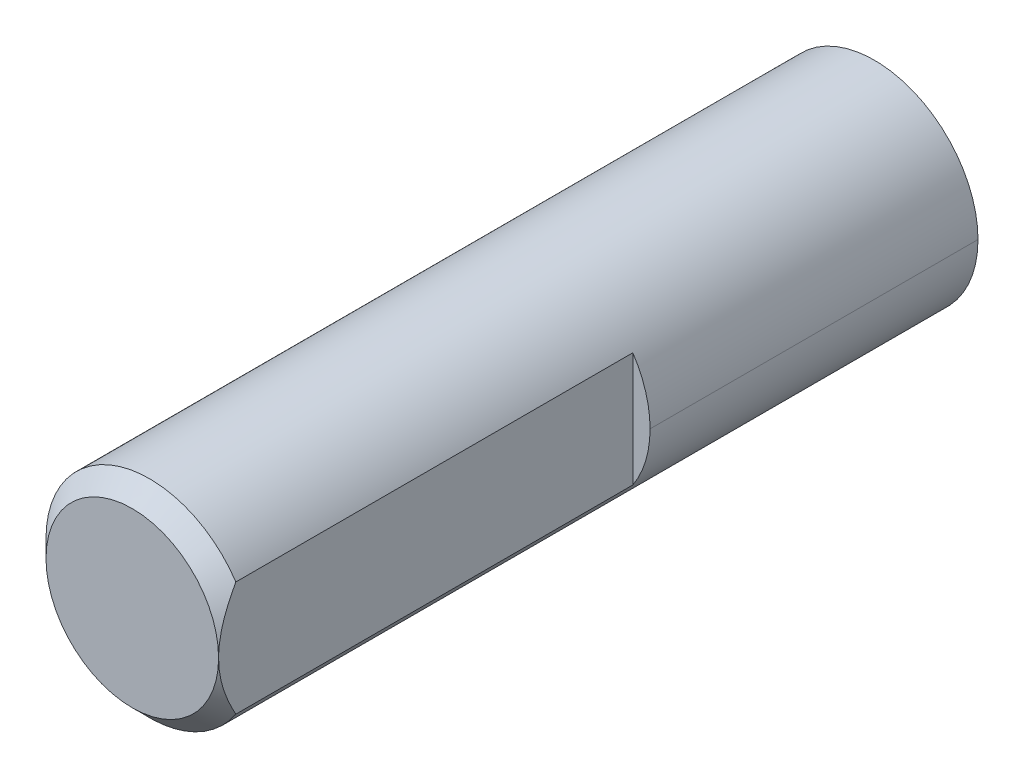
ISO-10303-21;
HEADER;
FILE_DESCRIPTION(('STEP AP214'),'2;1');
FILE_NAME('part.step','',(''),(''),'','','');
FILE_SCHEMA(('AUTOMOTIVE_DESIGN { 1 0 10303 214 1 1 1 1 }'));
ENDSEC;
DATA;
#1=APPLICATION_CONTEXT('core data for automotive mechanical design processes');
#2=APPLICATION_PROTOCOL_DEFINITION('international standard','automotive_design',2000,#1);
#3=PRODUCT_CONTEXT('',#1,'mechanical');
#4=PRODUCT('Part','Part','',(#3));
#5=PRODUCT_RELATED_PRODUCT_CATEGORY('part','',(#4));
#6=PRODUCT_DEFINITION_FORMATION('','',#4);
#7=PRODUCT_DEFINITION_CONTEXT('part definition',#1,'design');
#8=PRODUCT_DEFINITION('design','',#6,#7);
#9=PRODUCT_DEFINITION_SHAPE('','',#8);
#10=(LENGTH_UNIT() NAMED_UNIT(*) SI_UNIT(.MILLI.,.METRE.));
#11=(NAMED_UNIT(*) PLANE_ANGLE_UNIT() SI_UNIT($,.RADIAN.));
#12=(NAMED_UNIT(*) SI_UNIT($,.STERADIAN.) SOLID_ANGLE_UNIT());
#13=UNCERTAINTY_MEASURE_WITH_UNIT(LENGTH_MEASURE(1.E-05),#10,'distance_accuracy_value','');
#14=(GEOMETRIC_REPRESENTATION_CONTEXT(3) GLOBAL_UNCERTAINTY_ASSIGNED_CONTEXT((#13)) GLOBAL_UNIT_ASSIGNED_CONTEXT((#10,
#11,#12)) REPRESENTATION_CONTEXT('',''));
#15=CARTESIAN_POINT('',(0.,0.,0.));
#16=DIRECTION('',(0.,0.,1.));
#17=DIRECTION('',(1.,0.,0.));
#18=AXIS2_PLACEMENT_3D('',#15,#16,#17);
#19=CARTESIAN_POINT('',(0.,0.,21.5));
#20=DIRECTION('',(0.,0.,-1.));
#21=DIRECTION('',(-1.,0.,0.));
#22=AXIS2_PLACEMENT_3D('',#19,#20,#21);
#23=CONICAL_SURFACE('',#22,2.5,0.78539816339745);
#24=DIRECTION('',(-0.707106781186549,0.,-0.707106781186547));
#25=VECTOR('',#24,1.);
#26=CARTESIAN_POINT('',(-2.5,0.,21.5));
#27=LINE('',#26,#25);
#28=CARTESIAN_POINT('',(-2.5,0.,21.5));
#29=VERTEX_POINT('',#28);
#30=CARTESIAN_POINT('',(-3.,0.,21.));
#31=VERTEX_POINT('',#30);
#32=EDGE_CURVE('E90',#29,#31,#27,.T.);
#33=ORIENTED_EDGE('',*,*,#32,.F.);
#34=CARTESIAN_POINT('',(0.,0.,21.5));
#35=DIRECTION('',(0.,0.,1.));
#36=DIRECTION('',(1.,0.,0.));
#37=AXIS2_PLACEMENT_3D('',#34,#35,#36);
#38=CIRCLE('',#37,2.5);
#39=CARTESIAN_POINT('',(2.5,0.,21.5));
#40=VERTEX_POINT('',#39);
#41=EDGE_CURVE('E87',#40,#29,#38,.T.);
#42=ORIENTED_EDGE('',*,*,#41,.F.);
#43=CARTESIAN_POINT('',(2.5,1.6583123951777,21.));
#44=CARTESIAN_POINT('',(2.5,1.61304419071273,21.0250200255843));
#45=CARTESIAN_POINT('',(2.5,1.56747781751027,21.049499427219));
#46=CARTESIAN_POINT('',(2.5,1.47571363154993,21.0972096867305));
#47=CARTESIAN_POINT('',(2.5,1.42951600534283,21.1204409038781));
#48=CARTESIAN_POINT('',(2.5,1.28946898250347,21.188233741468));
#49=CARTESIAN_POINT('',(2.5,1.19456817295725,21.2306685534991));
#50=CARTESIAN_POINT('',(2.5,1.00435832661106,21.3071641313579));
#51=CARTESIAN_POINT('',(2.5,0.909128166857114,21.3414185932365));
#52=CARTESIAN_POINT('',(2.5,0.715960996402802,21.4011186383457));
#53=CARTESIAN_POINT('',(2.5,0.618025975916638,21.4265705213043));
#54=CARTESIAN_POINT('',(2.5,0.434096531038004,21.46395141614));
#55=CARTESIAN_POINT('',(2.5,0.348395131920397,21.4772928993308));
#56=CARTESIAN_POINT('',(2.5,0.218706232970866,21.4908266543301));
#57=CARTESIAN_POINT('',(2.5,0.175042274887079,21.4942588205655));
#58=CARTESIAN_POINT('',(2.5,0.087588185021699,21.4988484547413));
#59=CARTESIAN_POINT('',(2.5,0.0437980337548233,21.5000055502065));
#60=CARTESIAN_POINT('',(2.5,0.,21.5));
#61=B_SPLINE_CURVE_WITH_KNOTS('',3,(#43,#44,#45,#46,#47,#48,#49,#50,#51,#52,#53,#54,#55,#56,#57,
#58,#59,#60),.UNSPECIFIED.,.F.,.F.,(4,2,2,2,2,2,2,2,4),(0.,0.155160114661544,0.310275326953932,
0.621889187467568,0.925164565305234,1.22822244720193,1.48798349653102,1.61932602447731,
1.75069005406606),.UNSPECIFIED.);
#62=CARTESIAN_POINT('',(2.5,1.6583123951777,21.));
#63=VERTEX_POINT('',#62);
#64=EDGE_CURVE('E33',#63,#40,#61,.T.);
#65=ORIENTED_EDGE('',*,*,#64,.F.);
#66=CARTESIAN_POINT('',(0.,0.,21.));
#67=DIRECTION('',(0.,0.,-1.));
#68=DIRECTION('',(1.,0.,0.));
#69=AXIS2_PLACEMENT_3D('',#66,#67,#68);
#70=CIRCLE('',#69,3.);
#71=EDGE_CURVE('E288',#31,#63,#70,.T.);
#72=ORIENTED_EDGE('',*,*,#71,.F.);
#73=EDGE_LOOP('',(#33,#42,#65,#72));
#74=FACE_BOUND('',#73,.T.);
#75=ADVANCED_FACE('F17',(#74),#23,.T.);
#76=CARTESIAN_POINT('',(0.,0.,9.5));
#77=DIRECTION('',(0.,0.,1.));
#78=DIRECTION('',(1.,0.,0.));
#79=AXIS2_PLACEMENT_3D('',#76,#77,#78);
#80=PLANE('',#79);
#81=CARTESIAN_POINT('',(0.,0.,9.5));
#82=DIRECTION('',(0.,0.,1.));
#83=DIRECTION('',(1.,0.,0.));
#84=AXIS2_PLACEMENT_3D('',#81,#82,#83);
#85=CIRCLE('',#84,3.);
#86=CARTESIAN_POINT('',(2.5,-1.6583123951777,9.5));
#87=VERTEX_POINT('',#86);
#88=CARTESIAN_POINT('',(3.,0.,9.5));
#89=VERTEX_POINT('',#88);
#90=EDGE_CURVE('E117',#87,#89,#85,.T.);
#91=ORIENTED_EDGE('',*,*,#90,.T.);
#92=CARTESIAN_POINT('',(0.,0.,9.5));
#93=DIRECTION('',(0.,0.,1.));
#94=DIRECTION('',(1.,0.,0.));
#95=AXIS2_PLACEMENT_3D('',#92,#93,#94);
#96=CIRCLE('',#95,3.);
#97=CARTESIAN_POINT('',(2.5,1.6583123951777,9.5));
#98=VERTEX_POINT('',#97);
#99=EDGE_CURVE('E103',#89,#98,#96,.T.);
#100=ORIENTED_EDGE('',*,*,#99,.T.);
#101=DIRECTION('',(0.,-1.,0.));
#102=VECTOR('',#101,1.);
#103=CARTESIAN_POINT('',(2.5,1.6583123951777,9.5));
#104=LINE('',#103,#102);
#105=EDGE_CURVE('E11',#98,#87,#104,.T.);
#106=ORIENTED_EDGE('',*,*,#105,.T.);
#107=EDGE_LOOP('',(#91,#100,#106));
#108=FACE_BOUND('',#107,.T.);
#109=ADVANCED_FACE('F130',(#108),#80,.T.);
#110=CARTESIAN_POINT('',(2.5,1.6583123951777,9.5));
#111=DIRECTION('',(-1.,0.,0.));
#112=DIRECTION('',(0.,0.,1.));
#113=AXIS2_PLACEMENT_3D('',#110,#111,#112);
#114=PLANE('',#113);
#115=ORIENTED_EDGE('',*,*,#64,.T.);
#116=CARTESIAN_POINT('',(2.5,0.,21.5));
#117=CARTESIAN_POINT('',(2.5,-0.0768428391803912,21.5000643176381));
#118=CARTESIAN_POINT('',(2.5,-0.153646619440305,21.4964585669139));
#119=CARTESIAN_POINT('',(2.5,-0.306486913990632,21.4824138186157));
#120=CARTESIAN_POINT('',(2.5,-0.382524604614593,21.4719877566791));
#121=CARTESIAN_POINT('',(2.5,-0.532231201598343,21.4450231886171));
#122=CARTESIAN_POINT('',(2.5,-0.605918543015127,21.4285851348585));
#123=CARTESIAN_POINT('',(2.5,-0.751897163106769,21.3903277696489));
#124=CARTESIAN_POINT('',(2.5,-0.824187885624653,21.3685063602177));
#125=CARTESIAN_POINT('',(2.5,-0.96136120455937,21.3222417065684));
#126=CARTESIAN_POINT('',(2.5,-1.02636662586387,21.2981581621012));
#127=CARTESIAN_POINT('',(2.5,-1.15505562355539,21.2466971992364));
#128=CARTESIAN_POINT('',(2.5,-1.21873914323977,21.2193196398836));
#129=CARTESIAN_POINT('',(2.5,-1.34581351001767,21.1613450460911));
#130=CARTESIAN_POINT('',(2.5,-1.40918435962136,21.1307045192353));
#131=CARTESIAN_POINT('',(2.5,-1.53466113602633,21.067035036112));
#132=CARTESIAN_POINT('',(2.5,-1.59676793059763,21.0340077944289));
#133=CARTESIAN_POINT('',(2.5,-1.6583123951777,21.));
#134=B_SPLINE_CURVE_WITH_KNOTS('',3,(#116,#117,#118,#119,#120,#121,#122,#123,#124,#125,#126,
#127,#128,#129,#130,#131,#132,#133),.UNSPECIFIED.,.F.,.F.,(4,2,2,2,2,2,2,2,4),(0.,
0.230381722715166,0.460327757459298,0.686595219702826,0.912951001700759,1.120819357645,
1.32869661170077,1.53981070703045,1.75077462023261),.UNSPECIFIED.);
#135=CARTESIAN_POINT('',(2.5,-1.6583123951777,21.));
#136=VERTEX_POINT('',#135);
#137=EDGE_CURVE('E21',#40,#136,#134,.T.);
#138=ORIENTED_EDGE('',*,*,#137,.T.);
#139=DIRECTION('',(0.,0.,1.));
#140=VECTOR('',#139,1.);
#141=CARTESIAN_POINT('',(2.5,-1.6583123951777,9.5));
#142=LINE('',#141,#140);
#143=EDGE_CURVE('E113',#87,#136,#142,.T.);
#144=ORIENTED_EDGE('',*,*,#143,.F.);
#145=ORIENTED_EDGE('',*,*,#105,.F.);
#146=DIRECTION('',(0.,0.,1.));
#147=VECTOR('',#146,1.);
#148=CARTESIAN_POINT('',(2.5,1.6583123951777,9.5));
#149=LINE('',#148,#147);
#150=EDGE_CURVE('E83',#98,#63,#149,.T.);
#151=ORIENTED_EDGE('',*,*,#150,.T.);
#152=EDGE_LOOP('',(#115,#138,#144,#145,#151));
#153=FACE_BOUND('',#152,.T.);
#154=ADVANCED_FACE('F79',(#153),#114,.F.);
#155=CARTESIAN_POINT('',(0.,0.,0.));
#156=DIRECTION('',(0.,0.,1.));
#157=DIRECTION('',(1.,0.,0.));
#158=AXIS2_PLACEMENT_3D('',#155,#156,#157);
#159=PLANE('',#158);
#160=CARTESIAN_POINT('',(0.,0.,0.));
#161=DIRECTION('',(0.,0.,1.));
#162=DIRECTION('',(1.,0.,0.));
#163=AXIS2_PLACEMENT_3D('',#160,#161,#162);
#164=CIRCLE('',#163,3.);
#165=CARTESIAN_POINT('',(-3.,0.,0.));
#166=VERTEX_POINT('',#165);
#167=CARTESIAN_POINT('',(3.,0.,0.));
#168=VERTEX_POINT('',#167);
#169=EDGE_CURVE('E95',#166,#168,#164,.T.);
#170=ORIENTED_EDGE('',*,*,#169,.F.);
#171=CARTESIAN_POINT('',(0.,0.,0.));
#172=DIRECTION('',(0.,0.,1.));
#173=DIRECTION('',(1.,0.,0.));
#174=AXIS2_PLACEMENT_3D('',#171,#172,#173);
#175=CIRCLE('',#174,3.);
#176=EDGE_CURVE('E299',#168,#166,#175,.T.);
#177=ORIENTED_EDGE('',*,*,#176,.F.);
#178=EDGE_LOOP('',(#170,#177));
#179=FACE_BOUND('',#178,.T.);
#180=ADVANCED_FACE('F129',(#179),#159,.F.);
#181=CARTESIAN_POINT('',(0.,0.,21.5));
#182=DIRECTION('',(0.,0.,1.));
#183=DIRECTION('',(1.,0.,0.));
#184=AXIS2_PLACEMENT_3D('',#181,#182,#183);
#185=PLANE('',#184);
#186=ORIENTED_EDGE('',*,*,#41,.T.);
#187=CARTESIAN_POINT('',(0.,0.,21.5));
#188=DIRECTION('',(0.,0.,1.));
#189=DIRECTION('',(1.,0.,0.));
#190=AXIS2_PLACEMENT_3D('',#187,#188,#189);
#191=CIRCLE('',#190,2.5);
#192=EDGE_CURVE('E99',#29,#40,#191,.T.);
#193=ORIENTED_EDGE('',*,*,#192,.T.);
#194=EDGE_LOOP('',(#186,#193));
#195=FACE_BOUND('',#194,.T.);
#196=ADVANCED_FACE('F104',(#195),#185,.T.);
#197=CARTESIAN_POINT('',(0.,0.,21.5));
#198=DIRECTION('',(0.,0.,-1.));
#199=DIRECTION('',(-1.,0.,0.));
#200=AXIS2_PLACEMENT_3D('',#197,#198,#199);
#201=CYLINDRICAL_SURFACE('',#200,3.);
#202=DIRECTION('',(0.,0.,-1.));
#203=VECTOR('',#202,1.);
#204=CARTESIAN_POINT('',(3.,0.,21.5));
#205=LINE('',#204,#203);
#206=EDGE_CURVE('E292',#89,#168,#205,.T.);
#207=ORIENTED_EDGE('',*,*,#206,.F.);
#208=ORIENTED_EDGE('',*,*,#90,.F.);
#209=ORIENTED_EDGE('',*,*,#143,.T.);
#210=CARTESIAN_POINT('',(0.,0.,21.));
#211=DIRECTION('',(0.,0.,-1.));
#212=DIRECTION('',(1.,0.,0.));
#213=AXIS2_PLACEMENT_3D('',#210,#211,#212);
#214=CIRCLE('',#213,3.);
#215=EDGE_CURVE('E101',#136,#31,#214,.T.);
#216=ORIENTED_EDGE('',*,*,#215,.T.);
#217=DIRECTION('',(0.,0.,-1.));
#218=VECTOR('',#217,1.);
#219=CARTESIAN_POINT('',(-3.,0.,21.5));
#220=LINE('',#219,#218);
#221=EDGE_CURVE('E304',#31,#166,#220,.T.);
#222=ORIENTED_EDGE('',*,*,#221,.T.);
#223=ORIENTED_EDGE('',*,*,#169,.T.);
#224=EDGE_LOOP('',(#207,#208,#209,#216,#222,#223));
#225=FACE_BOUND('',#224,.T.);
#226=ADVANCED_FACE('F131',(#225),#201,.T.);
#227=CARTESIAN_POINT('',(0.,0.,21.5));
#228=DIRECTION('',(0.,0.,-1.));
#229=DIRECTION('',(-1.,0.,0.));
#230=AXIS2_PLACEMENT_3D('',#227,#228,#229);
#231=CYLINDRICAL_SURFACE('',#230,3.);
#232=ORIENTED_EDGE('',*,*,#99,.F.);
#233=ORIENTED_EDGE('',*,*,#206,.T.);
#234=ORIENTED_EDGE('',*,*,#176,.T.);
#235=ORIENTED_EDGE('',*,*,#221,.F.);
#236=ORIENTED_EDGE('',*,*,#71,.T.);
#237=ORIENTED_EDGE('',*,*,#150,.F.);
#238=EDGE_LOOP('',(#232,#233,#234,#235,#236,#237));
#239=FACE_BOUND('',#238,.T.);
#240=ADVANCED_FACE('F19',(#239),#231,.T.);
#241=CARTESIAN_POINT('',(0.,0.,21.5));
#242=DIRECTION('',(0.,0.,-1.));
#243=DIRECTION('',(-1.,0.,0.));
#244=AXIS2_PLACEMENT_3D('',#241,#242,#243);
#245=CONICAL_SURFACE('',#244,2.5,0.78539816339745);
#246=ORIENTED_EDGE('',*,*,#192,.F.);
#247=ORIENTED_EDGE('',*,*,#32,.T.);
#248=ORIENTED_EDGE('',*,*,#215,.F.);
#249=ORIENTED_EDGE('',*,*,#137,.F.);
#250=EDGE_LOOP('',(#246,#247,#248,#249));
#251=FACE_BOUND('',#250,.T.);
#252=ADVANCED_FACE('F98',(#251),#245,.T.);
#253=CLOSED_SHELL('',(#75,#109,#154,#180,#196,#226,#240,#252));
#254=MANIFOLD_SOLID_BREP('B1',#253);
#255=ADVANCED_BREP_SHAPE_REPRESENTATION('',(#18,#254),#14);
#256=SHAPE_DEFINITION_REPRESENTATION(#9,#255);
ENDSEC;
END-ISO-10303-21;
